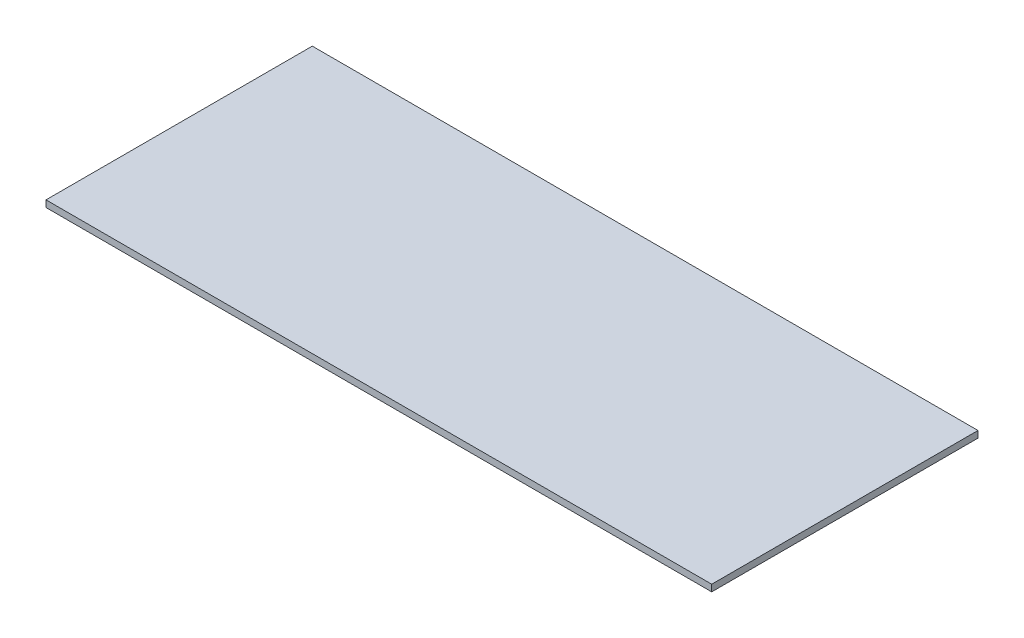
ISO-10303-21;
HEADER;
FILE_DESCRIPTION(('STEP AP214'),'2;1');
FILE_NAME('part.step','',(''),(''),'','','');
FILE_SCHEMA(('AUTOMOTIVE_DESIGN { 1 0 10303 214 1 1 1 1 }'));
ENDSEC;
DATA;
#1=APPLICATION_CONTEXT('core data for automotive mechanical design processes');
#2=APPLICATION_PROTOCOL_DEFINITION('international standard','automotive_design',2000,#1);
#3=PRODUCT_CONTEXT('',#1,'mechanical');
#4=PRODUCT('Part','Part','',(#3));
#5=PRODUCT_RELATED_PRODUCT_CATEGORY('part','',(#4));
#6=PRODUCT_DEFINITION_FORMATION('','',#4);
#7=PRODUCT_DEFINITION_CONTEXT('part definition',#1,'design');
#8=PRODUCT_DEFINITION('design','',#6,#7);
#9=PRODUCT_DEFINITION_SHAPE('','',#8);
#10=(LENGTH_UNIT() NAMED_UNIT(*) SI_UNIT(.MILLI.,.METRE.));
#11=(NAMED_UNIT(*) PLANE_ANGLE_UNIT() SI_UNIT($,.RADIAN.));
#12=(NAMED_UNIT(*) SI_UNIT($,.STERADIAN.) SOLID_ANGLE_UNIT());
#13=UNCERTAINTY_MEASURE_WITH_UNIT(LENGTH_MEASURE(1.E-05),#10,'distance_accuracy_value','');
#14=(GEOMETRIC_REPRESENTATION_CONTEXT(3) GLOBAL_UNCERTAINTY_ASSIGNED_CONTEXT((#13)) GLOBAL_UNIT_ASSIGNED_CONTEXT((#10,
#11,#12)) REPRESENTATION_CONTEXT('',''));
#15=CARTESIAN_POINT('',(0.,0.,0.));
#16=DIRECTION('',(0.,0.,1.));
#17=DIRECTION('',(1.,0.,0.));
#18=AXIS2_PLACEMENT_3D('',#15,#16,#17);
#19=CARTESIAN_POINT('',(250.,5.,100.));
#20=DIRECTION('',(-1.,0.,0.));
#21=DIRECTION('',(0.,0.,1.));
#22=AXIS2_PLACEMENT_3D('',#19,#20,#21);
#23=PLANE('',#22);
#24=DIRECTION('',(0.,0.,-1.));
#25=VECTOR('',#24,1.);
#26=CARTESIAN_POINT('',(250.,0.,100.));
#27=LINE('',#26,#25);
#28=CARTESIAN_POINT('',(250.,0.,100.));
#29=VERTEX_POINT('',#28);
#30=CARTESIAN_POINT('',(250.,0.,-100.));
#31=VERTEX_POINT('',#30);
#32=EDGE_CURVE('E100',#29,#31,#27,.T.);
#33=ORIENTED_EDGE('',*,*,#32,.T.);
#34=DIRECTION('',(0.,-1.,0.));
#35=VECTOR('',#34,1.);
#36=CARTESIAN_POINT('',(250.,5.,-100.));
#37=LINE('',#36,#35);
#38=CARTESIAN_POINT('',(250.,5.,-100.));
#39=VERTEX_POINT('',#38);
#40=EDGE_CURVE('E11',#39,#31,#37,.T.);
#41=ORIENTED_EDGE('',*,*,#40,.F.);
#42=DIRECTION('',(0.,0.,-1.));
#43=VECTOR('',#42,1.);
#44=CARTESIAN_POINT('',(250.,5.,100.));
#45=LINE('',#44,#43);
#46=CARTESIAN_POINT('',(250.,5.,100.));
#47=VERTEX_POINT('',#46);
#48=EDGE_CURVE('E88',#47,#39,#45,.T.);
#49=ORIENTED_EDGE('',*,*,#48,.F.);
#50=DIRECTION('',(0.,-1.,0.));
#51=VECTOR('',#50,1.);
#52=CARTESIAN_POINT('',(250.,5.,100.));
#53=LINE('',#52,#51);
#54=EDGE_CURVE('E96',#47,#29,#53,.T.);
#55=ORIENTED_EDGE('',*,*,#54,.T.);
#56=EDGE_LOOP('',(#33,#41,#49,#55));
#57=FACE_BOUND('',#56,.T.);
#58=ADVANCED_FACE('F37',(#57),#23,.F.);
#59=CARTESIAN_POINT('',(-250.,5.,-100.));
#60=DIRECTION('',(0.,0.,1.));
#61=DIRECTION('',(1.,0.,0.));
#62=AXIS2_PLACEMENT_3D('',#59,#60,#61);
#63=PLANE('',#62);
#64=DIRECTION('',(-1.,0.,0.));
#65=VECTOR('',#64,1.);
#66=CARTESIAN_POINT('',(-250.,0.,-100.));
#67=LINE('',#66,#65);
#68=CARTESIAN_POINT('',(-250.,0.,-100.));
#69=VERTEX_POINT('',#68);
#70=EDGE_CURVE('E92',#31,#69,#67,.T.);
#71=ORIENTED_EDGE('',*,*,#70,.T.);
#72=DIRECTION('',(0.,-1.,0.));
#73=VECTOR('',#72,1.);
#74=CARTESIAN_POINT('',(-250.,5.,-100.));
#75=LINE('',#74,#73);
#76=CARTESIAN_POINT('',(-250.,5.,-100.));
#77=VERTEX_POINT('',#76);
#78=EDGE_CURVE('E45',#77,#69,#75,.T.);
#79=ORIENTED_EDGE('',*,*,#78,.F.);
#80=DIRECTION('',(-1.,0.,0.));
#81=VECTOR('',#80,1.);
#82=CARTESIAN_POINT('',(-250.,5.,-100.));
#83=LINE('',#82,#81);
#84=EDGE_CURVE('E83',#39,#77,#83,.T.);
#85=ORIENTED_EDGE('',*,*,#84,.F.);
#86=ORIENTED_EDGE('',*,*,#40,.T.);
#87=EDGE_LOOP('',(#71,#79,#85,#86));
#88=FACE_BOUND('',#87,.T.);
#89=ADVANCED_FACE('F91',(#88),#63,.F.);
#90=CARTESIAN_POINT('',(-250.,5.,100.));
#91=DIRECTION('',(1.,0.,0.));
#92=DIRECTION('',(0.,0.,-1.));
#93=AXIS2_PLACEMENT_3D('',#90,#91,#92);
#94=PLANE('',#93);
#95=DIRECTION('',(0.,0.,1.));
#96=VECTOR('',#95,1.);
#97=CARTESIAN_POINT('',(-250.,0.,100.));
#98=LINE('',#97,#96);
#99=CARTESIAN_POINT('',(-250.,0.,100.));
#100=VERTEX_POINT('',#99);
#101=EDGE_CURVE('E70',#69,#100,#98,.T.);
#102=ORIENTED_EDGE('',*,*,#101,.T.);
#103=DIRECTION('',(0.,-1.,0.));
#104=VECTOR('',#103,1.);
#105=CARTESIAN_POINT('',(-250.,5.,100.));
#106=LINE('',#105,#104);
#107=CARTESIAN_POINT('',(-250.,5.,100.));
#108=VERTEX_POINT('',#107);
#109=EDGE_CURVE('E93',#108,#100,#106,.T.);
#110=ORIENTED_EDGE('',*,*,#109,.F.);
#111=DIRECTION('',(0.,0.,1.));
#112=VECTOR('',#111,1.);
#113=CARTESIAN_POINT('',(-250.,5.,100.));
#114=LINE('',#113,#112);
#115=EDGE_CURVE('E86',#77,#108,#114,.T.);
#116=ORIENTED_EDGE('',*,*,#115,.F.);
#117=ORIENTED_EDGE('',*,*,#78,.T.);
#118=EDGE_LOOP('',(#102,#110,#116,#117));
#119=FACE_BOUND('',#118,.T.);
#120=ADVANCED_FACE('F94',(#119),#94,.F.);
#121=CARTESIAN_POINT('',(-250.,5.,100.));
#122=DIRECTION('',(0.,0.,-1.));
#123=DIRECTION('',(-1.,0.,0.));
#124=AXIS2_PLACEMENT_3D('',#121,#122,#123);
#125=PLANE('',#124);
#126=DIRECTION('',(1.,0.,0.));
#127=VECTOR('',#126,1.);
#128=CARTESIAN_POINT('',(-250.,0.,100.));
#129=LINE('',#128,#127);
#130=EDGE_CURVE('E76',#100,#29,#129,.T.);
#131=ORIENTED_EDGE('',*,*,#130,.T.);
#132=ORIENTED_EDGE('',*,*,#54,.F.);
#133=DIRECTION('',(1.,0.,0.));
#134=VECTOR('',#133,1.);
#135=CARTESIAN_POINT('',(-250.,5.,100.));
#136=LINE('',#135,#134);
#137=EDGE_CURVE('E53',#108,#47,#136,.T.);
#138=ORIENTED_EDGE('',*,*,#137,.F.);
#139=ORIENTED_EDGE('',*,*,#109,.T.);
#140=EDGE_LOOP('',(#131,#132,#138,#139));
#141=FACE_BOUND('',#140,.T.);
#142=ADVANCED_FACE('F107',(#141),#125,.F.);
#143=CARTESIAN_POINT('',(0.,5.,0.));
#144=DIRECTION('',(0.,-1.,0.));
#145=DIRECTION('',(0.,0.,-1.));
#146=AXIS2_PLACEMENT_3D('',#143,#144,#145);
#147=PLANE('',#146);
#148=ORIENTED_EDGE('',*,*,#48,.T.);
#149=ORIENTED_EDGE('',*,*,#84,.T.);
#150=ORIENTED_EDGE('',*,*,#115,.T.);
#151=ORIENTED_EDGE('',*,*,#137,.T.);
#152=EDGE_LOOP('',(#148,#149,#150,#151));
#153=FACE_BOUND('',#152,.T.);
#154=ADVANCED_FACE('F84',(#153),#147,.F.);
#155=CARTESIAN_POINT('',(0.,0.,0.));
#156=DIRECTION('',(0.,-1.,0.));
#157=DIRECTION('',(0.,0.,-1.));
#158=AXIS2_PLACEMENT_3D('',#155,#156,#157);
#159=PLANE('',#158);
#160=ORIENTED_EDGE('',*,*,#32,.F.);
#161=ORIENTED_EDGE('',*,*,#130,.F.);
#162=ORIENTED_EDGE('',*,*,#101,.F.);
#163=ORIENTED_EDGE('',*,*,#70,.F.);
#164=EDGE_LOOP('',(#160,#161,#162,#163));
#165=FACE_BOUND('',#164,.T.);
#166=ADVANCED_FACE('F110',(#165),#159,.T.);
#167=CLOSED_SHELL('',(#58,#89,#120,#142,#154,#166));
#168=MANIFOLD_SOLID_BREP('B2',#167);
#169=ADVANCED_BREP_SHAPE_REPRESENTATION('',(#18,#168),#14);
#170=SHAPE_DEFINITION_REPRESENTATION(#9,#169);
ENDSEC;
END-ISO-10303-21;
